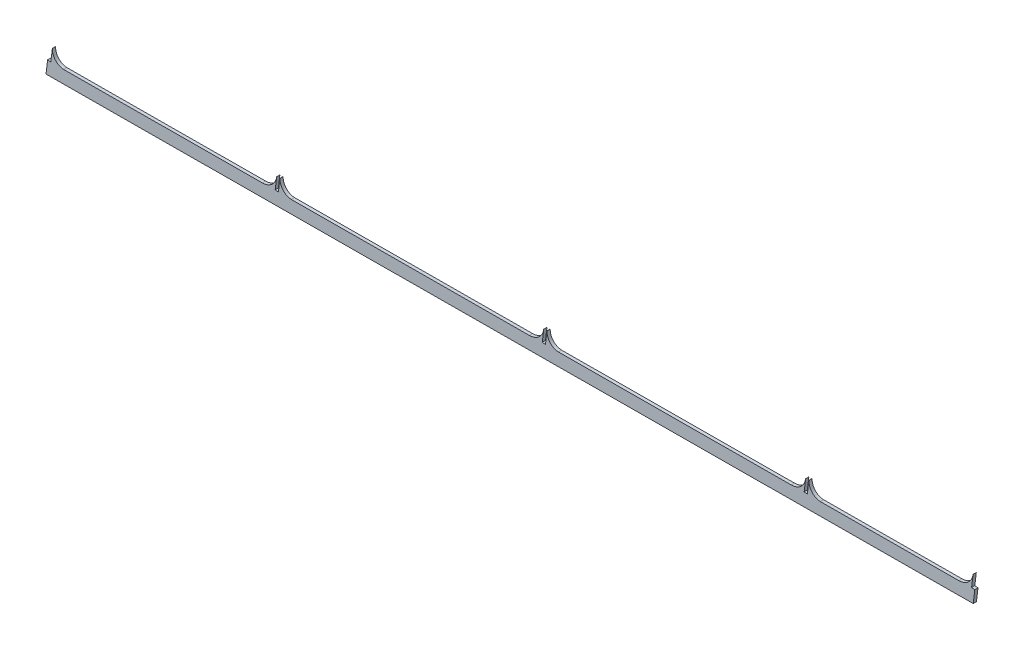
ISO-10303-21;
HEADER;
FILE_DESCRIPTION(('STEP AP214'),'2;1');
FILE_NAME('part.step','',(''),(''),'','','');
FILE_SCHEMA(('AUTOMOTIVE_DESIGN { 1 0 10303 214 1 1 1 1 }'));
ENDSEC;
DATA;
#1=APPLICATION_CONTEXT('core data for automotive mechanical design processes');
#2=APPLICATION_PROTOCOL_DEFINITION('international standard','automotive_design',2000,#1);
#3=PRODUCT_CONTEXT('',#1,'mechanical');
#4=PRODUCT('Part','Part','',(#3));
#5=PRODUCT_RELATED_PRODUCT_CATEGORY('part','',(#4));
#6=PRODUCT_DEFINITION_FORMATION('','',#4);
#7=PRODUCT_DEFINITION_CONTEXT('part definition',#1,'design');
#8=PRODUCT_DEFINITION('design','',#6,#7);
#9=PRODUCT_DEFINITION_SHAPE('','',#8);
#10=(LENGTH_UNIT() NAMED_UNIT(*) SI_UNIT(.MILLI.,.METRE.));
#11=(NAMED_UNIT(*) PLANE_ANGLE_UNIT() SI_UNIT($,.RADIAN.));
#12=(NAMED_UNIT(*) SI_UNIT($,.STERADIAN.) SOLID_ANGLE_UNIT());
#13=UNCERTAINTY_MEASURE_WITH_UNIT(LENGTH_MEASURE(1.E-05),#10,'distance_accuracy_value','');
#14=(GEOMETRIC_REPRESENTATION_CONTEXT(3) GLOBAL_UNCERTAINTY_ASSIGNED_CONTEXT((#13)) GLOBAL_UNIT_ASSIGNED_CONTEXT((#10,
#11,#12)) REPRESENTATION_CONTEXT('',''));
#15=CARTESIAN_POINT('',(0.,0.,0.));
#16=DIRECTION('',(0.,0.,1.));
#17=DIRECTION('',(1.,0.,0.));
#18=AXIS2_PLACEMENT_3D('',#15,#16,#17);
#19=CARTESIAN_POINT('',(571.86296221335,29.8868455378839,2.));
#20=DIRECTION('',(0.,0.,-1.));
#21=DIRECTION('',(-1.,0.,0.));
#22=AXIS2_PLACEMENT_3D('',#19,#20,#21);
#23=CYLINDRICAL_SURFACE('',#22,9.0055703663728);
#24=CARTESIAN_POINT('',(571.86296221335,29.8868455378839,0.));
#25=DIRECTION('',(0.,0.,1.));
#26=DIRECTION('',(1.,0.,0.));
#27=AXIS2_PLACEMENT_3D('',#24,#25,#26);
#28=CIRCLE('',#27,9.0055703663728);
#29=CARTESIAN_POINT('',(571.912079760243,20.8814091192376,0.));
#30=VERTEX_POINT('',#29);
#31=CARTESIAN_POINT('',(580.791756023501,28.7134152163468,0.));
#32=VERTEX_POINT('',#31);
#33=EDGE_CURVE('E259',#30,#32,#28,.T.);
#34=ORIENTED_EDGE('',*,*,#33,.F.);
#35=DIRECTION('',(0.,0.,-1.));
#36=VECTOR('',#35,1.);
#37=CARTESIAN_POINT('',(571.912079760243,20.8814091192376,2.));
#38=LINE('',#37,#36);
#39=CARTESIAN_POINT('',(571.912079760243,20.8814091192376,2.));
#40=VERTEX_POINT('',#39);
#41=EDGE_CURVE('E11',#40,#30,#38,.T.);
#42=ORIENTED_EDGE('',*,*,#41,.F.);
#43=CARTESIAN_POINT('',(571.86296221335,29.8868455378839,2.));
#44=DIRECTION('',(0.,0.,1.));
#45=DIRECTION('',(1.,0.,0.));
#46=AXIS2_PLACEMENT_3D('',#43,#44,#45);
#47=CIRCLE('',#46,9.0055703663728);
#48=CARTESIAN_POINT('',(580.791756023501,28.7134152163468,2.));
#49=VERTEX_POINT('',#48);
#50=EDGE_CURVE('E364',#40,#49,#47,.T.);
#51=ORIENTED_EDGE('',*,*,#50,.T.);
#52=DIRECTION('',(0.,0.,-1.));
#53=VECTOR('',#52,1.);
#54=CARTESIAN_POINT('',(580.791756023501,28.7134152163468,2.));
#55=LINE('',#54,#53);
#56=EDGE_CURVE('E56',#49,#32,#55,.T.);
#57=ORIENTED_EDGE('',*,*,#56,.T.);
#58=EDGE_LOOP('',(#34,#42,#51,#57));
#59=FACE_BOUND('',#58,.T.);
#60=ADVANCED_FACE('F39',(#59),#23,.F.);
#61=CARTESIAN_POINT('',(-0.0968752443684544,17.7615518059578,2.));
#62=DIRECTION('',(-0.00545412948803824,0.999985126125148,0.));
#63=DIRECTION('',(-0.999985126125148,-0.00545412948803824,0.));
#64=AXIS2_PLACEMENT_3D('',#61,#62,#63);
#65=PLANE('',#64);
#66=DIRECTION('',(0.999985126125148,0.00545412948803824,0.));
#67=VECTOR('',#66,1.);
#68=CARTESIAN_POINT('',(-0.0968752443684544,17.7615518059578,0.));
#69=LINE('',#68,#67);
#70=CARTESIAN_POINT('',(485.69022455328,20.4111369614708,0.));
#71=VERTEX_POINT('',#70);
#72=EDGE_CURVE('E262',#71,#30,#69,.T.);
#73=ORIENTED_EDGE('',*,*,#72,.F.);
#74=DIRECTION('',(0.,0.,-1.));
#75=VECTOR('',#74,1.);
#76=CARTESIAN_POINT('',(485.69022455328,20.4111369614708,2.));
#77=LINE('',#76,#75);
#78=CARTESIAN_POINT('',(485.69022455328,20.4111369614708,2.));
#79=VERTEX_POINT('',#78);
#80=EDGE_CURVE('E48',#79,#71,#77,.T.);
#81=ORIENTED_EDGE('',*,*,#80,.F.);
#82=DIRECTION('',(0.999985126125148,0.00545412948803824,0.));
#83=VECTOR('',#82,1.);
#84=CARTESIAN_POINT('',(-0.0968752443684544,17.7615518059578,2.));
#85=LINE('',#84,#83);
#86=EDGE_CURVE('E461',#79,#40,#85,.T.);
#87=ORIENTED_EDGE('',*,*,#86,.T.);
#88=ORIENTED_EDGE('',*,*,#41,.T.);
#89=EDGE_LOOP('',(#73,#81,#87,#88));
#90=FACE_BOUND('',#89,.T.);
#91=ADVANCED_FACE('F450',(#90),#65,.T.);
#92=CARTESIAN_POINT('',(486.110232413012,27.8578242681965,2.));
#93=DIRECTION('',(0.,0.,-1.));
#94=DIRECTION('',(-1.,0.,0.));
#95=AXIS2_PLACEMENT_3D('',#92,#93,#94);
#96=CYLINDRICAL_SURFACE('',#95,7.4585225377676);
#97=CARTESIAN_POINT('',(486.110232413012,27.8578242681965,0.));
#98=DIRECTION('',(0.,0.,1.));
#99=DIRECTION('',(1.,0.,0.));
#100=AXIS2_PLACEMENT_3D('',#97,#98,#99);
#101=CIRCLE('',#100,7.4585225377676);
#102=CARTESIAN_POINT('',(478.665298456165,28.3078429617791,0.));
#103=VERTEX_POINT('',#102);
#104=EDGE_CURVE('E266',#103,#71,#101,.T.);
#105=ORIENTED_EDGE('',*,*,#104,.F.);
#106=DIRECTION('',(0.,0.,-1.));
#107=VECTOR('',#106,1.);
#108=CARTESIAN_POINT('',(478.665298456165,28.3078429617791,2.));
#109=LINE('',#108,#107);
#110=CARTESIAN_POINT('',(478.665298456165,28.3078429617791,2.));
#111=VERTEX_POINT('',#110);
#112=EDGE_CURVE('E437',#111,#103,#109,.T.);
#113=ORIENTED_EDGE('',*,*,#112,.F.);
#114=CARTESIAN_POINT('',(486.110232413012,27.8578242681965,2.));
#115=DIRECTION('',(0.,0.,1.));
#116=DIRECTION('',(1.,0.,0.));
#117=AXIS2_PLACEMENT_3D('',#114,#115,#116);
#118=CIRCLE('',#117,7.4585225377676);
#119=EDGE_CURVE('E446',#111,#79,#118,.T.);
#120=ORIENTED_EDGE('',*,*,#119,.T.);
#121=ORIENTED_EDGE('',*,*,#80,.T.);
#122=EDGE_LOOP('',(#105,#113,#120,#121));
#123=FACE_BOUND('',#122,.T.);
#124=ADVANCED_FACE('F444',(#123),#96,.F.);
#125=CARTESIAN_POINT('',(468.131952417612,-57.4793762221042,2.));
#126=DIRECTION('',(-0.992546151641351,0.121869343404914,0.));
#127=DIRECTION('',(-0.121869343404914,-0.992546151641351,0.));
#128=AXIS2_PLACEMENT_3D('',#125,#126,#127);
#129=PLANE('',#128);
#130=DIRECTION('',(0.121869343404914,0.992546151641351,0.));
#131=VECTOR('',#130,1.);
#132=CARTESIAN_POINT('',(468.131952417612,-57.4793762221042,0.));
#133=LINE('',#132,#131);
#134=CARTESIAN_POINT('',(477.690343708926,20.3674737486484,0.));
#135=VERTEX_POINT('',#134);
#136=EDGE_CURVE('E270',#135,#103,#133,.T.);
#137=ORIENTED_EDGE('',*,*,#136,.F.);
#138=DIRECTION('',(0.,0.,-1.));
#139=VECTOR('',#138,1.);
#140=CARTESIAN_POINT('',(477.690343708926,20.3674737486484,2.));
#141=LINE('',#140,#139);
#142=CARTESIAN_POINT('',(477.690343708926,20.3674737486484,2.));
#143=VERTEX_POINT('',#142);
#144=EDGE_CURVE('E434',#143,#135,#141,.T.);
#145=ORIENTED_EDGE('',*,*,#144,.F.);
#146=DIRECTION('',(0.121869343404914,0.992546151641351,0.));
#147=VECTOR('',#146,1.);
#148=CARTESIAN_POINT('',(468.131952417612,-57.4793762221042,2.));
#149=LINE('',#148,#147);
#150=EDGE_CURVE('E460',#143,#111,#149,.T.);
#151=ORIENTED_EDGE('',*,*,#150,.T.);
#152=ORIENTED_EDGE('',*,*,#112,.T.);
#153=EDGE_LOOP('',(#137,#145,#151,#152));
#154=FACE_BOUND('',#153,.T.);
#155=ADVANCED_FACE('F456',(#154),#129,.T.);
#156=CARTESIAN_POINT('',(9.55839129133681,77.8468499708279,2.));
#157=DIRECTION('',(-0.121869343405077,-0.992546151641331,0.));
#158=DIRECTION('',(0.992546151641331,-0.121869343405077,0.));
#159=AXIS2_PLACEMENT_3D('',#156,#157,#158);
#160=PLANE('',#159);
#161=DIRECTION('',(-0.992546151641331,0.121869343405077,0.));
#162=VECTOR('',#161,1.);
#163=CARTESIAN_POINT('',(9.55839129133681,77.8468499708279,0.));
#164=LINE('',#163,#162);
#165=CARTESIAN_POINT('',(475.708969276083,20.6107559383691,0.));
#166=VERTEX_POINT('',#165);
#167=EDGE_CURVE('E274',#135,#166,#164,.T.);
#168=ORIENTED_EDGE('',*,*,#167,.T.);
#169=DIRECTION('',(0.,0.,-1.));
#170=VECTOR('',#169,1.);
#171=CARTESIAN_POINT('',(475.708969276083,20.6107559383691,2.));
#172=LINE('',#171,#170);
#173=CARTESIAN_POINT('',(475.708969276083,20.6107559383691,2.));
#174=VERTEX_POINT('',#173);
#175=EDGE_CURVE('E431',#174,#166,#172,.T.);
#176=ORIENTED_EDGE('',*,*,#175,.F.);
#177=DIRECTION('',(-0.992546151641331,0.121869343405077,0.));
#178=VECTOR('',#177,1.);
#179=CARTESIAN_POINT('',(9.55839129133681,77.8468499708279,2.));
#180=LINE('',#179,#178);
#181=EDGE_CURVE('E466',#143,#174,#180,.T.);
#182=ORIENTED_EDGE('',*,*,#181,.F.);
#183=ORIENTED_EDGE('',*,*,#144,.T.);
#184=EDGE_LOOP('',(#168,#176,#182,#183));
#185=FACE_BOUND('',#184,.T.);
#186=ADVANCED_FACE('F572',(#185),#160,.F.);
#187=CARTESIAN_POINT('',(466.150577984708,-57.2360940325896,2.));
#188=DIRECTION('',(0.992546151641296,-0.121869343405362,0.));
#189=DIRECTION('',(0.121869343405362,0.992546151641296,0.));
#190=AXIS2_PLACEMENT_3D('',#187,#188,#189);
#191=PLANE('',#190);
#192=DIRECTION('',(-0.121869343405362,-0.992546151641296,0.));
#193=VECTOR('',#192,1.);
#194=CARTESIAN_POINT('',(466.150577984708,-57.2360940325896,0.));
#195=LINE('',#194,#193);
#196=CARTESIAN_POINT('',(476.634048821774,28.1449242318934,0.));
#197=VERTEX_POINT('',#196);
#198=EDGE_CURVE('E278',#197,#166,#195,.T.);
#199=ORIENTED_EDGE('',*,*,#198,.F.);
#200=DIRECTION('',(0.,0.,-1.));
#201=VECTOR('',#200,1.);
#202=CARTESIAN_POINT('',(476.634048821774,28.1449242318934,2.));
#203=LINE('',#202,#201);
#204=CARTESIAN_POINT('',(476.634048821774,28.1449242318934,2.));
#205=VERTEX_POINT('',#204);
#206=EDGE_CURVE('E428',#205,#197,#203,.T.);
#207=ORIENTED_EDGE('',*,*,#206,.F.);
#208=DIRECTION('',(-0.121869343405362,-0.992546151641296,0.));
#209=VECTOR('',#208,1.);
#210=CARTESIAN_POINT('',(466.150577984708,-57.2360940325896,2.));
#211=LINE('',#210,#209);
#212=EDGE_CURVE('E473',#205,#174,#211,.T.);
#213=ORIENTED_EDGE('',*,*,#212,.T.);
#214=ORIENTED_EDGE('',*,*,#175,.T.);
#215=EDGE_LOOP('',(#199,#207,#213,#214));
#216=FACE_BOUND('',#215,.T.);
#217=ADVANCED_FACE('F575',(#216),#191,.T.);
#218=CARTESIAN_POINT('',(467.705255011622,29.3183545534222,2.));
#219=DIRECTION('',(0.,0.,-1.));
#220=DIRECTION('',(-1.,0.,0.));
#221=AXIS2_PLACEMENT_3D('',#218,#219,#220);
#222=CYLINDRICAL_SURFACE('',#221,9.00557036637264);
#223=CARTESIAN_POINT('',(467.705255011622,29.3183545534222,0.));
#224=DIRECTION('',(0.,0.,1.));
#225=DIRECTION('',(1.,0.,0.));
#226=AXIS2_PLACEMENT_3D('',#223,#224,#225);
#227=CIRCLE('',#226,9.00557036637264);
#228=CARTESIAN_POINT('',(467.677868382555,20.3128258295638,0.));
#229=VERTEX_POINT('',#228);
#230=EDGE_CURVE('E282',#229,#197,#227,.T.);
#231=ORIENTED_EDGE('',*,*,#230,.F.);
#232=DIRECTION('',(0.,0.,-1.));
#233=VECTOR('',#232,1.);
#234=CARTESIAN_POINT('',(467.677868382555,20.3128258295638,2.));
#235=LINE('',#234,#233);
#236=CARTESIAN_POINT('',(467.677868382555,20.3128258295638,2.));
#237=VERTEX_POINT('',#236);
#238=EDGE_CURVE('E425',#237,#229,#235,.T.);
#239=ORIENTED_EDGE('',*,*,#238,.F.);
#240=CARTESIAN_POINT('',(467.705255011622,29.3183545534222,2.));
#241=DIRECTION('',(0.,0.,1.));
#242=DIRECTION('',(1.,0.,0.));
#243=AXIS2_PLACEMENT_3D('',#240,#241,#242);
#244=CIRCLE('',#243,9.00557036637264);
#245=EDGE_CURVE('E477',#237,#205,#244,.T.);
#246=ORIENTED_EDGE('',*,*,#245,.T.);
#247=ORIENTED_EDGE('',*,*,#206,.T.);
#248=EDGE_LOOP('',(#231,#239,#246,#247));
#249=FACE_BOUND('',#248,.T.);
#250=ADVANCED_FACE('F579',(#249),#222,.F.);
#251=CARTESIAN_POINT('',(-0.096932242378329,17.7597189682627,2.));
#252=DIRECTION('',(-0.00545790160297811,0.999985105544124,0.));
#253=DIRECTION('',(-0.999985105544124,-0.00545790160297811,0.));
#254=AXIS2_PLACEMENT_3D('',#251,#252,#253);
#255=PLANE('',#254);
#256=DIRECTION('',(0.999985105544124,0.00545790160297811,0.));
#257=VECTOR('',#256,1.);
#258=CARTESIAN_POINT('',(-0.096932242378329,17.7597189682627,0.));
#259=LINE('',#258,#257);
#260=CARTESIAN_POINT('',(322.805939428483,19.5221173191258,0.));
#261=VERTEX_POINT('',#260);
#262=EDGE_CURVE('E286',#261,#229,#259,.T.);
#263=ORIENTED_EDGE('',*,*,#262,.F.);
#264=DIRECTION('',(0.,0.,-1.));
#265=VECTOR('',#264,1.);
#266=CARTESIAN_POINT('',(322.805939428483,19.5221173191258,2.));
#267=LINE('',#266,#265);
#268=CARTESIAN_POINT('',(322.805939428483,19.5221173191258,2.));
#269=VERTEX_POINT('',#268);
#270=EDGE_CURVE('E422',#269,#261,#267,.T.);
#271=ORIENTED_EDGE('',*,*,#270,.F.);
#272=DIRECTION('',(0.999985105544124,0.00545790160297811,0.));
#273=VECTOR('',#272,1.);
#274=CARTESIAN_POINT('',(-0.096932242378329,17.7597189682627,2.));
#275=LINE('',#274,#273);
#276=EDGE_CURVE('E481',#269,#237,#275,.T.);
#277=ORIENTED_EDGE('',*,*,#276,.T.);
#278=ORIENTED_EDGE('',*,*,#238,.T.);
#279=EDGE_LOOP('',(#263,#271,#277,#278));
#280=FACE_BOUND('',#279,.T.);
#281=ADVANCED_FACE('F583',(#280),#255,.T.);
#282=CARTESIAN_POINT('',(323.225947288216,26.9688046258515,2.));
#283=DIRECTION('',(0.,0.,-1.));
#284=DIRECTION('',(-1.,0.,0.));
#285=AXIS2_PLACEMENT_3D('',#282,#283,#284);
#286=CYLINDRICAL_SURFACE('',#285,7.45852253776758);
#287=CARTESIAN_POINT('',(323.225947288216,26.9688046258515,0.));
#288=DIRECTION('',(0.,0.,1.));
#289=DIRECTION('',(1.,0.,0.));
#290=AXIS2_PLACEMENT_3D('',#287,#288,#289);
#291=CIRCLE('',#290,7.45852253776758);
#292=CARTESIAN_POINT('',(315.781013331369,27.4188233194341,0.));
#293=VERTEX_POINT('',#292);
#294=EDGE_CURVE('E290',#293,#261,#291,.T.);
#295=ORIENTED_EDGE('',*,*,#294,.F.);
#296=DIRECTION('',(0.,0.,-1.));
#297=VECTOR('',#296,1.);
#298=CARTESIAN_POINT('',(315.781013331369,27.4188233194341,2.));
#299=LINE('',#298,#297);
#300=CARTESIAN_POINT('',(315.781013331369,27.4188233194341,2.));
#301=VERTEX_POINT('',#300);
#302=EDGE_CURVE('E419',#301,#293,#299,.T.);
#303=ORIENTED_EDGE('',*,*,#302,.F.);
#304=CARTESIAN_POINT('',(323.225947288216,26.9688046258515,2.));
#305=DIRECTION('',(0.,0.,1.));
#306=DIRECTION('',(1.,0.,0.));
#307=AXIS2_PLACEMENT_3D('',#304,#305,#306);
#308=CIRCLE('',#307,7.45852253776758);
#309=EDGE_CURVE('E485',#301,#269,#308,.T.);
#310=ORIENTED_EDGE('',*,*,#309,.T.);
#311=ORIENTED_EDGE('',*,*,#270,.T.);
#312=EDGE_LOOP('',(#295,#303,#310,#311));
#313=FACE_BOUND('',#312,.T.);
#314=ADVANCED_FACE('F587',(#313),#286,.F.);
#315=CARTESIAN_POINT('',(307.774383646617,-37.7899425533892,2.));
#316=DIRECTION('',(-0.992546151641253,0.121869343405711,0.));
#317=DIRECTION('',(-0.121869343405711,-0.992546151641253,0.));
#318=AXIS2_PLACEMENT_3D('',#315,#316,#317);
#319=PLANE('',#318);
#320=DIRECTION('',(0.121869343405711,0.992546151641253,0.));
#321=VECTOR('',#320,1.);
#322=CARTESIAN_POINT('',(307.774383646617,-37.7899425533892,0.));
#323=LINE('',#322,#321);
#324=CARTESIAN_POINT('',(314.806058584123,19.4784541063042,0.));
#325=VERTEX_POINT('',#324);
#326=EDGE_CURVE('E294',#325,#293,#323,.T.);
#327=ORIENTED_EDGE('',*,*,#326,.F.);
#328=DIRECTION('',(0.,0.,-1.));
#329=VECTOR('',#328,1.);
#330=CARTESIAN_POINT('',(314.806058584123,19.4784541063042,2.));
#331=LINE('',#330,#329);
#332=CARTESIAN_POINT('',(314.806058584123,19.4784541063042,2.));
#333=VERTEX_POINT('',#332);
#334=EDGE_CURVE('E416',#333,#325,#331,.T.);
#335=ORIENTED_EDGE('',*,*,#334,.F.);
#336=DIRECTION('',(0.121869343405711,0.992546151641253,0.));
#337=VECTOR('',#336,1.);
#338=CARTESIAN_POINT('',(307.774383646617,-37.7899425533892,2.));
#339=LINE('',#338,#337);
#340=EDGE_CURVE('E489',#333,#301,#339,.T.);
#341=ORIENTED_EDGE('',*,*,#340,.T.);
#342=ORIENTED_EDGE('',*,*,#302,.T.);
#343=EDGE_LOOP('',(#327,#335,#341,#342));
#344=FACE_BOUND('',#343,.T.);
#345=ADVANCED_FACE('F591',(#344),#319,.T.);
#346=CARTESIAN_POINT('',(7.03167493744612,57.2683966595014,2.));
#347=DIRECTION('',(-0.121869343405077,-0.992546151641331,0.));
#348=DIRECTION('',(0.992546151641331,-0.121869343405077,0.));
#349=AXIS2_PLACEMENT_3D('',#346,#347,#348);
#350=PLANE('',#349);
#351=DIRECTION('',(-0.992546151641331,0.121869343405077,0.));
#352=VECTOR('',#351,1.);
#353=CARTESIAN_POINT('',(7.03167493744612,57.2683966595014,0.));
#354=LINE('',#353,#352);
#355=CARTESIAN_POINT('',(312.824684151282,19.7217362960247,0.));
#356=VERTEX_POINT('',#355);
#357=EDGE_CURVE('E298',#325,#356,#354,.T.);
#358=ORIENTED_EDGE('',*,*,#357,.T.);
#359=DIRECTION('',(0.,0.,-1.));
#360=VECTOR('',#359,1.);
#361=CARTESIAN_POINT('',(312.824684151282,19.7217362960247,2.));
#362=LINE('',#361,#360);
#363=CARTESIAN_POINT('',(312.824684151282,19.7217362960247,2.));
#364=VERTEX_POINT('',#363);
#365=EDGE_CURVE('E413',#364,#356,#362,.T.);
#366=ORIENTED_EDGE('',*,*,#365,.F.);
#367=DIRECTION('',(-0.992546151641331,0.121869343405077,0.));
#368=VECTOR('',#367,1.);
#369=CARTESIAN_POINT('',(7.03167493744612,57.2683966595014,2.));
#370=LINE('',#369,#368);
#371=EDGE_CURVE('E493',#333,#364,#370,.T.);
#372=ORIENTED_EDGE('',*,*,#371,.F.);
#373=ORIENTED_EDGE('',*,*,#334,.T.);
#374=EDGE_LOOP('',(#358,#366,#372,#373));
#375=FACE_BOUND('',#374,.T.);
#376=ADVANCED_FACE('F595',(#375),#350,.F.);
#377=CARTESIAN_POINT('',(305.793009213809,-37.5466603635634,2.));
#378=DIRECTION('',(0.992546151641295,-0.121869343405365,0.));
#379=DIRECTION('',(0.121869343405365,0.992546151641295,0.));
#380=AXIS2_PLACEMENT_3D('',#377,#378,#379);
#381=PLANE('',#380);
#382=DIRECTION('',(-0.121869343405365,-0.992546151641295,0.));
#383=VECTOR('',#382,1.);
#384=CARTESIAN_POINT('',(305.793009213809,-37.5466603635634,0.));
#385=LINE('',#384,#383);
#386=CARTESIAN_POINT('',(313.749763696973,27.2559045895474,0.));
#387=VERTEX_POINT('',#386);
#388=EDGE_CURVE('E302',#387,#356,#385,.T.);
#389=ORIENTED_EDGE('',*,*,#388,.F.);
#390=DIRECTION('',(0.,0.,-1.));
#391=VECTOR('',#390,1.);
#392=CARTESIAN_POINT('',(313.749763696973,27.2559045895474,2.));
#393=LINE('',#392,#391);
#394=CARTESIAN_POINT('',(313.749763696973,27.2559045895474,2.));
#395=VERTEX_POINT('',#394);
#396=EDGE_CURVE('E410',#395,#387,#393,.T.);
#397=ORIENTED_EDGE('',*,*,#396,.F.);
#398=DIRECTION('',(-0.121869343405365,-0.992546151641295,0.));
#399=VECTOR('',#398,1.);
#400=CARTESIAN_POINT('',(305.793009213809,-37.5466603635634,2.));
#401=LINE('',#400,#399);
#402=EDGE_CURVE('E496',#395,#364,#401,.T.);
#403=ORIENTED_EDGE('',*,*,#402,.T.);
#404=ORIENTED_EDGE('',*,*,#365,.T.);
#405=EDGE_LOOP('',(#389,#397,#403,#404));
#406=FACE_BOUND('',#405,.T.);
#407=ADVANCED_FACE('F599',(#406),#381,.T.);
#408=CARTESIAN_POINT('',(304.820969886821,28.4293349110772,2.));
#409=DIRECTION('',(0.,0.,-1.));
#410=DIRECTION('',(-1.,0.,0.));
#411=AXIS2_PLACEMENT_3D('',#408,#409,#410);
#412=CYLINDRICAL_SURFACE('',#411,9.00557036637266);
#413=CARTESIAN_POINT('',(304.820969886821,28.4293349110772,0.));
#414=DIRECTION('',(0.,0.,1.));
#415=DIRECTION('',(1.,0.,0.));
#416=AXIS2_PLACEMENT_3D('',#413,#414,#415);
#417=CIRCLE('',#416,9.00557036637266);
#418=CARTESIAN_POINT('',(304.793583257754,19.4238061872189,0.));
#419=VERTEX_POINT('',#418);
#420=EDGE_CURVE('E306',#419,#387,#417,.T.);
#421=ORIENTED_EDGE('',*,*,#420,.F.);
#422=DIRECTION('',(0.,0.,-1.));
#423=VECTOR('',#422,1.);
#424=CARTESIAN_POINT('',(304.793583257754,19.4238061872189,2.));
#425=LINE('',#424,#423);
#426=CARTESIAN_POINT('',(304.793583257754,19.4238061872189,2.));
#427=VERTEX_POINT('',#426);
#428=EDGE_CURVE('E407',#427,#419,#425,.T.);
#429=ORIENTED_EDGE('',*,*,#428,.F.);
#430=CARTESIAN_POINT('',(304.820969886821,28.4293349110772,2.));
#431=DIRECTION('',(0.,0.,1.));
#432=DIRECTION('',(1.,0.,0.));
#433=AXIS2_PLACEMENT_3D('',#430,#431,#432);
#434=CIRCLE('',#433,9.00557036637266);
#435=EDGE_CURVE('E500',#427,#395,#434,.T.);
#436=ORIENTED_EDGE('',*,*,#435,.T.);
#437=ORIENTED_EDGE('',*,*,#396,.T.);
#438=EDGE_LOOP('',(#421,#429,#436,#437));
#439=FACE_BOUND('',#438,.T.);
#440=ADVANCED_FACE('F603',(#439),#412,.F.);
#441=CARTESIAN_POINT('',(-0.0969322423781985,17.7597189682669,2.));
#442=DIRECTION('',(-0.00545790160296949,0.999985105544124,0.));
#443=DIRECTION('',(-0.999985105544124,-0.00545790160296949,0.));
#444=AXIS2_PLACEMENT_3D('',#441,#442,#443);
#445=PLANE('',#444);
#446=DIRECTION('',(0.999985105544124,0.00545790160296949,0.));
#447=VECTOR('',#446,1.);
#448=CARTESIAN_POINT('',(-0.0969322423781985,17.7597189682669,0.));
#449=LINE('',#448,#447);
#450=CARTESIAN_POINT('',(156.683570495634,18.6154242707399,0.));
#451=VERTEX_POINT('',#450);
#452=EDGE_CURVE('E310',#451,#419,#449,.T.);
#453=ORIENTED_EDGE('',*,*,#452,.F.);
#454=DIRECTION('',(0.,0.,-1.));
#455=VECTOR('',#454,1.);
#456=CARTESIAN_POINT('',(156.683570495634,18.6154242707399,2.));
#457=LINE('',#456,#455);
#458=CARTESIAN_POINT('',(156.683570495634,18.6154242707399,2.));
#459=VERTEX_POINT('',#458);
#460=EDGE_CURVE('E404',#459,#451,#457,.T.);
#461=ORIENTED_EDGE('',*,*,#460,.F.);
#462=DIRECTION('',(0.999985105544124,0.00545790160296949,0.));
#463=VECTOR('',#462,1.);
#464=CARTESIAN_POINT('',(-0.0969322423781985,17.7597189682669,2.));
#465=LINE('',#464,#463);
#466=EDGE_CURVE('E504',#459,#427,#465,.T.);
#467=ORIENTED_EDGE('',*,*,#466,.T.);
#468=ORIENTED_EDGE('',*,*,#428,.T.);
#469=EDGE_LOOP('',(#453,#461,#467,#468));
#470=FACE_BOUND('',#469,.T.);
#471=ADVANCED_FACE('F607',(#470),#445,.T.);
#472=CARTESIAN_POINT('',(157.103578355367,26.0621115774657,2.));
#473=DIRECTION('',(0.,0.,-1.));
#474=DIRECTION('',(-1.,0.,0.));
#475=AXIS2_PLACEMENT_3D('',#472,#473,#474);
#476=CYLINDRICAL_SURFACE('',#475,7.45852253776765);
#477=CARTESIAN_POINT('',(157.103578355367,26.0621115774657,0.));
#478=DIRECTION('',(0.,0.,1.));
#479=DIRECTION('',(1.,0.,0.));
#480=AXIS2_PLACEMENT_3D('',#477,#478,#479);
#481=CIRCLE('',#480,7.45852253776765);
#482=CARTESIAN_POINT('',(149.65864439852,26.512130271048,0.));
#483=VERTEX_POINT('',#482);
#484=EDGE_CURVE('E314',#483,#451,#481,.T.);
#485=ORIENTED_EDGE('',*,*,#484,.F.);
#486=DIRECTION('',(0.,0.,-1.));
#487=VECTOR('',#486,1.);
#488=CARTESIAN_POINT('',(149.65864439852,26.512130271048,2.));
#489=LINE('',#488,#487);
#490=CARTESIAN_POINT('',(149.65864439852,26.512130271048,2.));
#491=VERTEX_POINT('',#490);
#492=EDGE_CURVE('E401',#491,#483,#489,.T.);
#493=ORIENTED_EDGE('',*,*,#492,.F.);
#494=CARTESIAN_POINT('',(157.103578355367,26.0621115774657,2.));
#495=DIRECTION('',(0.,0.,1.));
#496=DIRECTION('',(1.,0.,0.));
#497=AXIS2_PLACEMENT_3D('',#494,#495,#496);
#498=CIRCLE('',#497,7.45852253776765);
#499=EDGE_CURVE('E508',#491,#459,#498,.T.);
#500=ORIENTED_EDGE('',*,*,#499,.T.);
#501=ORIENTED_EDGE('',*,*,#460,.T.);
#502=EDGE_LOOP('',(#485,#493,#500,#501));
#503=FACE_BOUND('',#502,.T.);
#504=ADVANCED_FACE('F611',(#503),#476,.F.);
#505=CARTESIAN_POINT('',(144.228961323554,-17.7090896855924,2.));
#506=DIRECTION('',(-0.992546151641324,0.121869343405133,0.));
#507=DIRECTION('',(-0.121869343405133,-0.992546151641324,0.));
#508=AXIS2_PLACEMENT_3D('',#505,#506,#507);
#509=PLANE('',#508);
#510=DIRECTION('',(0.121869343405133,0.992546151641324,0.));
#511=VECTOR('',#510,1.);
#512=CARTESIAN_POINT('',(144.228961323554,-17.7090896855924,0.));
#513=LINE('',#512,#511);
#514=CARTESIAN_POINT('',(148.683689651279,18.5717610579173,0.));
#515=VERTEX_POINT('',#514);
#516=EDGE_CURVE('E318',#515,#483,#513,.T.);
#517=ORIENTED_EDGE('',*,*,#516,.F.);
#518=DIRECTION('',(0.,0.,-1.));
#519=VECTOR('',#518,1.);
#520=CARTESIAN_POINT('',(148.683689651279,18.5717610579173,2.));
#521=LINE('',#520,#519);
#522=CARTESIAN_POINT('',(148.683689651279,18.5717610579173,2.));
#523=VERTEX_POINT('',#522);
#524=EDGE_CURVE('E398',#523,#515,#521,.T.);
#525=ORIENTED_EDGE('',*,*,#524,.F.);
#526=DIRECTION('',(0.121869343405133,0.992546151641324,0.));
#527=VECTOR('',#526,1.);
#528=CARTESIAN_POINT('',(144.228961323554,-17.7090896855924,2.));
#529=LINE('',#528,#527);
#530=EDGE_CURVE('E512',#523,#491,#529,.T.);
#531=ORIENTED_EDGE('',*,*,#530,.T.);
#532=ORIENTED_EDGE('',*,*,#492,.T.);
#533=EDGE_LOOP('',(#517,#525,#531,#532));
#534=FACE_BOUND('',#533,.T.);
#535=ADVANCED_FACE('F615',(#534),#509,.T.);
#536=CARTESIAN_POINT('',(4.45472832772806,36.2808507435173,2.));
#537=DIRECTION('',(-0.121869343405187,-0.992546151641317,0.));
#538=DIRECTION('',(0.992546151641317,-0.121869343405187,0.));
#539=AXIS2_PLACEMENT_3D('',#536,#537,#538);
#540=PLANE('',#539);
#541=DIRECTION('',(-0.992546151641317,0.121869343405187,0.));
#542=VECTOR('',#541,1.);
#543=CARTESIAN_POINT('',(4.45472832772806,36.2808507435173,0.));
#544=LINE('',#543,#542);
#545=CARTESIAN_POINT('',(146.702315218436,18.8150432476383,0.));
#546=VERTEX_POINT('',#545);
#547=EDGE_CURVE('E322',#515,#546,#544,.T.);
#548=ORIENTED_EDGE('',*,*,#547,.T.);
#549=DIRECTION('',(0.,0.,-1.));
#550=VECTOR('',#549,1.);
#551=CARTESIAN_POINT('',(146.702315218436,18.8150432476383,2.));
#552=LINE('',#551,#550);
#553=CARTESIAN_POINT('',(146.702315218436,18.8150432476383,2.));
#554=VERTEX_POINT('',#553);
#555=EDGE_CURVE('E395',#554,#546,#552,.T.);
#556=ORIENTED_EDGE('',*,*,#555,.F.);
#557=DIRECTION('',(-0.992546151641317,0.121869343405187,0.));
#558=VECTOR('',#557,1.);
#559=CARTESIAN_POINT('',(4.45472832772806,36.2808507435173,2.));
#560=LINE('',#559,#558);
#561=EDGE_CURVE('E516',#523,#554,#560,.T.);
#562=ORIENTED_EDGE('',*,*,#561,.F.);
#563=ORIENTED_EDGE('',*,*,#524,.T.);
#564=EDGE_LOOP('',(#548,#556,#562,#563));
#565=FACE_BOUND('',#564,.T.);
#566=ADVANCED_FACE('F619',(#565),#540,.F.);
#567=CARTESIAN_POINT('',(142.247586890697,-17.4658074959058,2.));
#568=DIRECTION('',(0.992546151641294,-0.121869343405379,0.));
#569=DIRECTION('',(0.121869343405379,0.992546151641294,0.));
#570=AXIS2_PLACEMENT_3D('',#567,#568,#569);
#571=PLANE('',#570);
#572=DIRECTION('',(-0.121869343405379,-0.992546151641294,0.));
#573=VECTOR('',#572,1.);
#574=CARTESIAN_POINT('',(142.247586890697,-17.4658074959058,0.));
#575=LINE('',#574,#573);
#576=CARTESIAN_POINT('',(147.627394764126,26.349211541154,0.));
#577=VERTEX_POINT('',#576);
#578=EDGE_CURVE('E326',#577,#546,#575,.T.);
#579=ORIENTED_EDGE('',*,*,#578,.F.);
#580=DIRECTION('',(0.,0.,-1.));
#581=VECTOR('',#580,1.);
#582=CARTESIAN_POINT('',(147.627394764126,26.349211541154,2.));
#583=LINE('',#582,#581);
#584=CARTESIAN_POINT('',(147.627394764126,26.349211541154,2.));
#585=VERTEX_POINT('',#584);
#586=EDGE_CURVE('E392',#585,#577,#583,.T.);
#587=ORIENTED_EDGE('',*,*,#586,.F.);
#588=DIRECTION('',(-0.121869343405379,-0.992546151641294,0.));
#589=VECTOR('',#588,1.);
#590=CARTESIAN_POINT('',(142.247586890697,-17.4658074959058,2.));
#591=LINE('',#590,#589);
#592=EDGE_CURVE('E519',#585,#554,#591,.T.);
#593=ORIENTED_EDGE('',*,*,#592,.T.);
#594=ORIENTED_EDGE('',*,*,#555,.T.);
#595=EDGE_LOOP('',(#579,#587,#593,#594));
#596=FACE_BOUND('',#595,.T.);
#597=ADVANCED_FACE('F623',(#596),#571,.T.);
#598=CARTESIAN_POINT('',(138.698600953975,27.5226418626902,2.));
#599=DIRECTION('',(0.,0.,-1.));
#600=DIRECTION('',(-1.,0.,0.));
#601=AXIS2_PLACEMENT_3D('',#598,#599,#600);
#602=CYLINDRICAL_SURFACE('',#601,9.00557036637265);
#603=CARTESIAN_POINT('',(138.698600953975,27.5226418626902,0.));
#604=DIRECTION('',(0.,0.,1.));
#605=DIRECTION('',(1.,0.,0.));
#606=AXIS2_PLACEMENT_3D('',#603,#604,#605);
#607=CIRCLE('',#606,9.00557036637265);
#608=CARTESIAN_POINT('',(138.671214324908,18.5171131388318,0.));
#609=VERTEX_POINT('',#608);
#610=EDGE_CURVE('E330',#609,#577,#607,.T.);
#611=ORIENTED_EDGE('',*,*,#610,.F.);
#612=DIRECTION('',(0.,0.,-1.));
#613=VECTOR('',#612,1.);
#614=CARTESIAN_POINT('',(138.671214324908,18.5171131388318,2.));
#615=LINE('',#614,#613);
#616=CARTESIAN_POINT('',(138.671214324908,18.5171131388318,2.));
#617=VERTEX_POINT('',#616);
#618=EDGE_CURVE('E389',#617,#609,#615,.T.);
#619=ORIENTED_EDGE('',*,*,#618,.F.);
#620=CARTESIAN_POINT('',(138.698600953975,27.5226418626902,2.));
#621=DIRECTION('',(0.,0.,1.));
#622=DIRECTION('',(1.,0.,0.));
#623=AXIS2_PLACEMENT_3D('',#620,#621,#622);
#624=CIRCLE('',#623,9.00557036637265);
#625=EDGE_CURVE('E523',#617,#585,#624,.T.);
#626=ORIENTED_EDGE('',*,*,#625,.T.);
#627=ORIENTED_EDGE('',*,*,#586,.T.);
#628=EDGE_LOOP('',(#611,#619,#626,#627));
#629=FACE_BOUND('',#628,.T.);
#630=ADVANCED_FACE('F627',(#629),#602,.F.);
#631=CARTESIAN_POINT('',(-0.0969322423781684,17.7597189682673,2.));
#632=DIRECTION('',(-0.00545790160296765,0.999985105544124,0.));
#633=DIRECTION('',(-0.999985105544124,-0.00545790160296765,0.));
#634=AXIS2_PLACEMENT_3D('',#631,#632,#633);
#635=PLANE('',#634);
#636=DIRECTION('',(0.999985105544124,0.00545790160296765,0.));
#637=VECTOR('',#636,1.);
#638=CARTESIAN_POINT('',(-0.0969322423781684,17.7597189682673,0.));
#639=LINE('',#638,#637);
#640=CARTESIAN_POINT('',(15.1250438666505,17.8428002535237,0.));
#641=VERTEX_POINT('',#640);
#642=EDGE_CURVE('E334',#641,#609,#639,.T.);
#643=ORIENTED_EDGE('',*,*,#642,.F.);
#644=DIRECTION('',(0.,0.,-1.));
#645=VECTOR('',#644,1.);
#646=CARTESIAN_POINT('',(15.1250438666505,17.8428002535237,2.));
#647=LINE('',#646,#645);
#648=CARTESIAN_POINT('',(15.1250438666505,17.8428002535237,2.));
#649=VERTEX_POINT('',#648);
#650=EDGE_CURVE('E386',#649,#641,#647,.T.);
#651=ORIENTED_EDGE('',*,*,#650,.F.);
#652=DIRECTION('',(0.999985105544124,0.00545790160296765,0.));
#653=VECTOR('',#652,1.);
#654=CARTESIAN_POINT('',(-0.0969322423781684,17.7597189682673,2.));
#655=LINE('',#654,#653);
#656=EDGE_CURVE('E527',#649,#617,#655,.T.);
#657=ORIENTED_EDGE('',*,*,#656,.T.);
#658=ORIENTED_EDGE('',*,*,#618,.T.);
#659=EDGE_LOOP('',(#643,#651,#657,#658));
#660=FACE_BOUND('',#659,.T.);
#661=ADVANCED_FACE('F631',(#660),#635,.T.);
#662=CARTESIAN_POINT('',(15.5450517263835,25.2894875602495,2.));
#663=DIRECTION('',(0.,0.,-1.));
#664=DIRECTION('',(-1.,0.,0.));
#665=AXIS2_PLACEMENT_3D('',#662,#663,#664);
#666=CYLINDRICAL_SURFACE('',#665,7.45852253776767);
#667=CARTESIAN_POINT('',(15.5450517263835,25.2894875602495,0.));
#668=DIRECTION('',(0.,0.,1.));
#669=DIRECTION('',(1.,0.,0.));
#670=AXIS2_PLACEMENT_3D('',#667,#668,#669);
#671=CIRCLE('',#670,7.45852253776767);
#672=CARTESIAN_POINT('',(8.10011776953644,25.7395062538318,0.));
#673=VERTEX_POINT('',#672);
#674=EDGE_CURVE('E338',#673,#641,#671,.T.);
#675=ORIENTED_EDGE('',*,*,#674,.F.);
#676=DIRECTION('',(0.,0.,-1.));
#677=VECTOR('',#676,1.);
#678=CARTESIAN_POINT('',(8.10011776953644,25.7395062538318,2.));
#679=LINE('',#678,#677);
#680=CARTESIAN_POINT('',(8.10011776953644,25.7395062538318,2.));
#681=VERTEX_POINT('',#680);
#682=EDGE_CURVE('E383',#681,#673,#679,.T.);
#683=ORIENTED_EDGE('',*,*,#682,.F.);
#684=CARTESIAN_POINT('',(15.5450517263835,25.2894875602495,2.));
#685=DIRECTION('',(0.,0.,1.));
#686=DIRECTION('',(1.,0.,0.));
#687=AXIS2_PLACEMENT_3D('',#684,#685,#686);
#688=CIRCLE('',#687,7.45852253776767);
#689=EDGE_CURVE('E531',#681,#649,#688,.T.);
#690=ORIENTED_EDGE('',*,*,#689,.T.);
#691=ORIENTED_EDGE('',*,*,#650,.T.);
#692=EDGE_LOOP('',(#675,#683,#690,#691));
#693=FACE_BOUND('',#692,.T.);
#694=ADVANCED_FACE('F635',(#693),#666,.F.);
#695=CARTESIAN_POINT('',(4.86633863946202,-0.597511253051125,2.));
#696=DIRECTION('',(0.992546151641323,-0.121869343405136,0.));
#697=DIRECTION('',(0.121869343405136,0.992546151641324,0.));
#698=AXIS2_PLACEMENT_3D('',#695,#696,#697);
#699=PLANE('',#698);
#700=DIRECTION('',(-0.121869343405136,-0.992546151641324,0.));
#701=VECTOR('',#700,1.);
#702=CARTESIAN_POINT('',(4.86633863946202,-0.597511253051125,0.));
#703=LINE('',#702,#701);
#704=CARTESIAN_POINT('',(7.12516302229534,17.7991370407011,0.));
#705=VERTEX_POINT('',#704);
#706=EDGE_CURVE('E342',#673,#705,#703,.T.);
#707=ORIENTED_EDGE('',*,*,#706,.T.);
#708=DIRECTION('',(0.,0.,-1.));
#709=VECTOR('',#708,1.);
#710=CARTESIAN_POINT('',(7.12516302229534,17.7991370407011,2.));
#711=LINE('',#710,#709);
#712=CARTESIAN_POINT('',(7.12516302229534,17.7991370407011,2.));
#713=VERTEX_POINT('',#712);
#714=EDGE_CURVE('E379',#713,#705,#711,.T.);
#715=ORIENTED_EDGE('',*,*,#714,.F.);
#716=DIRECTION('',(-0.121869343405136,-0.992546151641324,0.));
#717=VECTOR('',#716,1.);
#718=CARTESIAN_POINT('',(4.86633863946202,-0.597511253051125,2.));
#719=LINE('',#718,#717);
#720=EDGE_CURVE('E535',#681,#713,#719,.T.);
#721=ORIENTED_EDGE('',*,*,#720,.F.);
#722=ORIENTED_EDGE('',*,*,#682,.T.);
#723=EDGE_LOOP('',(#707,#715,#721,#722));
#724=FACE_BOUND('',#723,.T.);
#725=ADVANCED_FACE('F639',(#724),#699,.F.);
#726=CARTESIAN_POINT('',(2.25882438283541,18.3966482937525,2.));
#727=DIRECTION('',(-0.121869343405245,-0.99254615164131,0.));
#728=DIRECTION('',(0.99254615164131,-0.121869343405245,0.));
#729=AXIS2_PLACEMENT_3D('',#726,#727,#728);
#730=PLANE('',#729);
#731=DIRECTION('',(-0.99254615164131,0.121869343405245,0.));
#732=VECTOR('',#731,1.);
#733=CARTESIAN_POINT('',(2.25882438283541,18.3966482937525,0.));
#734=LINE('',#733,#732);
#735=CARTESIAN_POINT('',(5.14378858945139,18.0424192304223,0.));
#736=VERTEX_POINT('',#735);
#737=EDGE_CURVE('E345',#705,#736,#734,.T.);
#738=ORIENTED_EDGE('',*,*,#737,.T.);
#739=DIRECTION('',(0.,0.,-1.));
#740=VECTOR('',#739,1.);
#741=CARTESIAN_POINT('',(5.14378858945139,18.0424192304223,2.));
#742=LINE('',#741,#740);
#743=CARTESIAN_POINT('',(5.14378858945139,18.0424192304223,2.));
#744=VERTEX_POINT('',#743);
#745=EDGE_CURVE('E375',#744,#736,#742,.T.);
#746=ORIENTED_EDGE('',*,*,#745,.F.);
#747=DIRECTION('',(-0.99254615164131,0.121869343405245,0.));
#748=VECTOR('',#747,1.);
#749=CARTESIAN_POINT('',(2.25882438283541,18.3966482937525,2.));
#750=LINE('',#749,#748);
#751=EDGE_CURVE('E538',#713,#744,#750,.T.);
#752=ORIENTED_EDGE('',*,*,#751,.F.);
#753=ORIENTED_EDGE('',*,*,#714,.T.);
#754=EDGE_LOOP('',(#738,#746,#752,#753));
#755=FACE_BOUND('',#754,.T.);
#756=ADVANCED_FACE('F643',(#755),#730,.F.);
#757=CARTESIAN_POINT('',(2.88496420661582,-0.354229063330234,2.));
#758=DIRECTION('',(0.992546151641309,-0.121869343405254,0.));
#759=DIRECTION('',(0.121869343405254,0.992546151641309,0.));
#760=AXIS2_PLACEMENT_3D('',#757,#758,#759);
#761=PLANE('',#760);
#762=DIRECTION('',(-0.121869343405254,-0.992546151641309,0.));
#763=VECTOR('',#762,1.);
#764=CARTESIAN_POINT('',(2.88496420661582,-0.354229063330234,0.));
#765=LINE('',#764,#763);
#766=CARTESIAN_POINT('',(4.13761379303406,9.84778312131002,0.));
#767=VERTEX_POINT('',#766);
#768=EDGE_CURVE('E348',#736,#767,#765,.T.);
#769=ORIENTED_EDGE('',*,*,#768,.T.);
#770=DIRECTION('',(0.,0.,-1.));
#771=VECTOR('',#770,1.);
#772=CARTESIAN_POINT('',(4.13761379303406,9.84778312131002,2.));
#773=LINE('',#772,#771);
#774=CARTESIAN_POINT('',(4.13761379303406,9.84778312131002,2.));
#775=VERTEX_POINT('',#774);
#776=EDGE_CURVE('E371',#775,#767,#773,.T.);
#777=ORIENTED_EDGE('',*,*,#776,.F.);
#778=DIRECTION('',(-0.121869343405254,-0.992546151641309,0.));
#779=VECTOR('',#778,1.);
#780=CARTESIAN_POINT('',(2.88496420661582,-0.354229063330234,2.));
#781=LINE('',#780,#779);
#782=EDGE_CURVE('E253',#744,#775,#781,.T.);
#783=ORIENTED_EDGE('',*,*,#782,.F.);
#784=ORIENTED_EDGE('',*,*,#745,.T.);
#785=EDGE_LOOP('',(#769,#777,#783,#784));
#786=FACE_BOUND('',#785,.T.);
#787=ADVANCED_FACE('F546',(#786),#761,.F.);
#788=CARTESIAN_POINT('',(-0.0536241766385602,9.82490741615575,2.));
#789=DIRECTION('',(-0.00545790160296583,0.999985105544124,0.));
#790=DIRECTION('',(-0.999985105544124,-0.00545790160296583,0.));
#791=AXIS2_PLACEMENT_3D('',#788,#789,#790);
#792=PLANE('',#791);
#793=DIRECTION('',(0.999985105544124,0.00545790160296583,0.));
#794=VECTOR('',#793,1.);
#795=CARTESIAN_POINT('',(-0.0536241766385602,9.82490741615575,0.));
#796=LINE('',#795,#794);
#797=CARTESIAN_POINT('',(580.873096163411,12.9955955199794,0.));
#798=VERTEX_POINT('',#797);
#799=EDGE_CURVE('E351',#767,#798,#796,.T.);
#800=ORIENTED_EDGE('',*,*,#799,.T.);
#801=DIRECTION('',(0.,0.,-1.));
#802=VECTOR('',#801,1.);
#803=CARTESIAN_POINT('',(580.873096163411,12.9955955199794,2.));
#804=LINE('',#803,#802);
#805=CARTESIAN_POINT('',(580.873096163411,12.9955955199794,2.));
#806=VERTEX_POINT('',#805);
#807=EDGE_CURVE('E237',#806,#798,#804,.T.);
#808=ORIENTED_EDGE('',*,*,#807,.F.);
#809=DIRECTION('',(0.999985105544124,0.00545790160296583,0.));
#810=VECTOR('',#809,1.);
#811=CARTESIAN_POINT('',(-0.0536241766385602,9.82490741615575,2.));
#812=LINE('',#811,#810);
#813=EDGE_CURVE('E248',#775,#806,#812,.T.);
#814=ORIENTED_EDGE('',*,*,#813,.F.);
#815=ORIENTED_EDGE('',*,*,#776,.T.);
#816=EDGE_LOOP('',(#800,#808,#814,#815));
#817=FACE_BOUND('',#816,.T.);
#818=ADVANCED_FACE('F550',(#817),#792,.F.);
#819=CARTESIAN_POINT('',(570.673929888419,-70.069947900078,2.));
#820=DIRECTION('',(0.992546151641323,-0.121869343405136,0.));
#821=DIRECTION('',(0.121869343405136,0.992546151641323,0.));
#822=AXIS2_PLACEMENT_3D('',#819,#820,#821);
#823=PLANE('',#822);
#824=DIRECTION('',(-0.121869343405136,-0.992546151641323,0.));
#825=VECTOR('',#824,1.);
#826=CARTESIAN_POINT('',(570.673929888419,-70.069947900078,0.));
#827=LINE('',#826,#825);
#828=CARTESIAN_POINT('',(581.848050910652,20.9359647331099,0.));
#829=VERTEX_POINT('',#828);
#830=EDGE_CURVE('E233',#829,#798,#827,.T.);
#831=ORIENTED_EDGE('',*,*,#830,.F.);
#832=DIRECTION('',(0.,0.,-1.));
#833=VECTOR('',#832,1.);
#834=CARTESIAN_POINT('',(581.848050910652,20.9359647331099,2.));
#835=LINE('',#834,#833);
#836=CARTESIAN_POINT('',(581.848050910652,20.9359647331099,2.));
#837=VERTEX_POINT('',#836);
#838=EDGE_CURVE('E227',#837,#829,#835,.T.);
#839=ORIENTED_EDGE('',*,*,#838,.F.);
#840=DIRECTION('',(-0.121869343405136,-0.992546151641323,0.));
#841=VECTOR('',#840,1.);
#842=CARTESIAN_POINT('',(570.673929888419,-70.069947900078,2.));
#843=LINE('',#842,#841);
#844=EDGE_CURVE('E231',#837,#806,#843,.T.);
#845=ORIENTED_EDGE('',*,*,#844,.T.);
#846=ORIENTED_EDGE('',*,*,#807,.T.);
#847=EDGE_LOOP('',(#831,#839,#845,#846));
#848=FACE_BOUND('',#847,.T.);
#849=ADVANCED_FACE('F229',(#848),#823,.T.);
#850=CARTESIAN_POINT('',(11.1741210222595,91.00591263328,2.));
#851=DIRECTION('',(-0.1218693434053,-0.992546151641303,0.));
#852=DIRECTION('',(0.992546151641303,-0.1218693434053,0.));
#853=AXIS2_PLACEMENT_3D('',#850,#851,#852);
#854=PLANE('',#853);
#855=DIRECTION('',(-0.992546151641303,0.1218693434053,0.));
#856=VECTOR('',#855,1.);
#857=CARTESIAN_POINT('',(11.1741210222595,91.00591263328,0.));
#858=LINE('',#857,#856);
#859=CARTESIAN_POINT('',(579.866676477811,21.1792469228309,0.));
#860=VERTEX_POINT('',#859);
#861=EDGE_CURVE('E357',#829,#860,#858,.T.);
#862=ORIENTED_EDGE('',*,*,#861,.T.);
#863=DIRECTION('',(0.,0.,-1.));
#864=VECTOR('',#863,1.);
#865=CARTESIAN_POINT('',(579.866676477811,21.1792469228309,2.));
#866=LINE('',#865,#864);
#867=CARTESIAN_POINT('',(579.866676477811,21.1792469228309,2.));
#868=VERTEX_POINT('',#867);
#869=EDGE_CURVE('E142',#868,#860,#866,.T.);
#870=ORIENTED_EDGE('',*,*,#869,.F.);
#871=DIRECTION('',(-0.992546151641303,0.1218693434053,0.));
#872=VECTOR('',#871,1.);
#873=CARTESIAN_POINT('',(11.1741210222595,91.00591263328,2.));
#874=LINE('',#873,#872);
#875=EDGE_CURVE('E239',#837,#868,#874,.T.);
#876=ORIENTED_EDGE('',*,*,#875,.F.);
#877=ORIENTED_EDGE('',*,*,#838,.T.);
#878=EDGE_LOOP('',(#862,#870,#876,#877));
#879=FACE_BOUND('',#878,.T.);
#880=ADVANCED_FACE('F240',(#879),#854,.F.);
#881=CARTESIAN_POINT('',(568.69255545554,-69.8266657104878,2.));
#882=DIRECTION('',(0.992546151641295,-0.121869343405369,0.));
#883=DIRECTION('',(0.121869343405369,0.992546151641295,0.));
#884=AXIS2_PLACEMENT_3D('',#881,#882,#883);
#885=PLANE('',#884);
#886=DIRECTION('',(-0.121869343405369,-0.992546151641295,0.));
#887=VECTOR('',#886,1.);
#888=CARTESIAN_POINT('',(568.69255545554,-69.8266657104878,0.));
#889=LINE('',#888,#887);
#890=EDGE_CURVE('E360',#32,#860,#889,.T.);
#891=ORIENTED_EDGE('',*,*,#890,.F.);
#892=ORIENTED_EDGE('',*,*,#56,.F.);
#893=DIRECTION('',(-0.121869343405369,-0.992546151641295,0.));
#894=VECTOR('',#893,1.);
#895=CARTESIAN_POINT('',(568.69255545554,-69.8266657104878,2.));
#896=LINE('',#895,#894);
#897=EDGE_CURVE('E244',#49,#868,#896,.T.);
#898=ORIENTED_EDGE('',*,*,#897,.T.);
#899=ORIENTED_EDGE('',*,*,#869,.T.);
#900=EDGE_LOOP('',(#891,#892,#898,#899));
#901=FACE_BOUND('',#900,.T.);
#902=ADVANCED_FACE('F551',(#901),#885,.T.);
#903=CARTESIAN_POINT('',(0.,0.,2.));
#904=DIRECTION('',(0.,0.,1.));
#905=DIRECTION('',(1.,0.,0.));
#906=AXIS2_PLACEMENT_3D('',#903,#904,#905);
#907=PLANE('',#906);
#908=ORIENTED_EDGE('',*,*,#50,.F.);
#909=ORIENTED_EDGE('',*,*,#86,.F.);
#910=ORIENTED_EDGE('',*,*,#119,.F.);
#911=ORIENTED_EDGE('',*,*,#150,.F.);
#912=ORIENTED_EDGE('',*,*,#181,.T.);
#913=ORIENTED_EDGE('',*,*,#212,.F.);
#914=ORIENTED_EDGE('',*,*,#245,.F.);
#915=ORIENTED_EDGE('',*,*,#276,.F.);
#916=ORIENTED_EDGE('',*,*,#309,.F.);
#917=ORIENTED_EDGE('',*,*,#340,.F.);
#918=ORIENTED_EDGE('',*,*,#371,.T.);
#919=ORIENTED_EDGE('',*,*,#402,.F.);
#920=ORIENTED_EDGE('',*,*,#435,.F.);
#921=ORIENTED_EDGE('',*,*,#466,.F.);
#922=ORIENTED_EDGE('',*,*,#499,.F.);
#923=ORIENTED_EDGE('',*,*,#530,.F.);
#924=ORIENTED_EDGE('',*,*,#561,.T.);
#925=ORIENTED_EDGE('',*,*,#592,.F.);
#926=ORIENTED_EDGE('',*,*,#625,.F.);
#927=ORIENTED_EDGE('',*,*,#656,.F.);
#928=ORIENTED_EDGE('',*,*,#689,.F.);
#929=ORIENTED_EDGE('',*,*,#720,.T.);
#930=ORIENTED_EDGE('',*,*,#751,.T.);
#931=ORIENTED_EDGE('',*,*,#782,.T.);
#932=ORIENTED_EDGE('',*,*,#813,.T.);
#933=ORIENTED_EDGE('',*,*,#844,.F.);
#934=ORIENTED_EDGE('',*,*,#875,.T.);
#935=ORIENTED_EDGE('',*,*,#897,.F.);
#936=EDGE_LOOP('',(#908,#909,#910,#911,#912,#913,#914,#915,#916,#917,#918,#919,#920,#921,#922,
#923,#924,#925,#926,#927,#928,#929,#930,#931,#932,#933,#934,#935));
#937=FACE_BOUND('',#936,.T.);
#938=ADVANCED_FACE('F246',(#937),#907,.T.);
#939=CARTESIAN_POINT('',(0.,0.,0.));
#940=DIRECTION('',(0.,0.,1.));
#941=DIRECTION('',(1.,0.,0.));
#942=AXIS2_PLACEMENT_3D('',#939,#940,#941);
#943=PLANE('',#942);
#944=ORIENTED_EDGE('',*,*,#33,.T.);
#945=ORIENTED_EDGE('',*,*,#890,.T.);
#946=ORIENTED_EDGE('',*,*,#861,.F.);
#947=ORIENTED_EDGE('',*,*,#830,.T.);
#948=ORIENTED_EDGE('',*,*,#799,.F.);
#949=ORIENTED_EDGE('',*,*,#768,.F.);
#950=ORIENTED_EDGE('',*,*,#737,.F.);
#951=ORIENTED_EDGE('',*,*,#706,.F.);
#952=ORIENTED_EDGE('',*,*,#674,.T.);
#953=ORIENTED_EDGE('',*,*,#642,.T.);
#954=ORIENTED_EDGE('',*,*,#610,.T.);
#955=ORIENTED_EDGE('',*,*,#578,.T.);
#956=ORIENTED_EDGE('',*,*,#547,.F.);
#957=ORIENTED_EDGE('',*,*,#516,.T.);
#958=ORIENTED_EDGE('',*,*,#484,.T.);
#959=ORIENTED_EDGE('',*,*,#452,.T.);
#960=ORIENTED_EDGE('',*,*,#420,.T.);
#961=ORIENTED_EDGE('',*,*,#388,.T.);
#962=ORIENTED_EDGE('',*,*,#357,.F.);
#963=ORIENTED_EDGE('',*,*,#326,.T.);
#964=ORIENTED_EDGE('',*,*,#294,.T.);
#965=ORIENTED_EDGE('',*,*,#262,.T.);
#966=ORIENTED_EDGE('',*,*,#230,.T.);
#967=ORIENTED_EDGE('',*,*,#198,.T.);
#968=ORIENTED_EDGE('',*,*,#167,.F.);
#969=ORIENTED_EDGE('',*,*,#136,.T.);
#970=ORIENTED_EDGE('',*,*,#104,.T.);
#971=ORIENTED_EDGE('',*,*,#72,.T.);
#972=EDGE_LOOP('',(#944,#945,#946,#947,#948,#949,#950,#951,#952,#953,#954,#955,#956,#957,#958,
#959,#960,#961,#962,#963,#964,#965,#966,#967,#968,#969,#970,#971));
#973=FACE_BOUND('',#972,.T.);
#974=ADVANCED_FACE('F452',(#973),#943,.F.);
#975=CLOSED_SHELL('',(#60,#91,#124,#155,#186,#217,#250,#281,#314,#345,#376,#407,#440,#471,#504,
#535,#566,#597,#630,#661,#694,#725,#756,#787,#818,#849,#880,#902,#938,#974));
#976=MANIFOLD_SOLID_BREP('B2',#975);
#977=ADVANCED_BREP_SHAPE_REPRESENTATION('',(#18,#976),#14);
#978=SHAPE_DEFINITION_REPRESENTATION(#9,#977);
ENDSEC;
END-ISO-10303-21;
